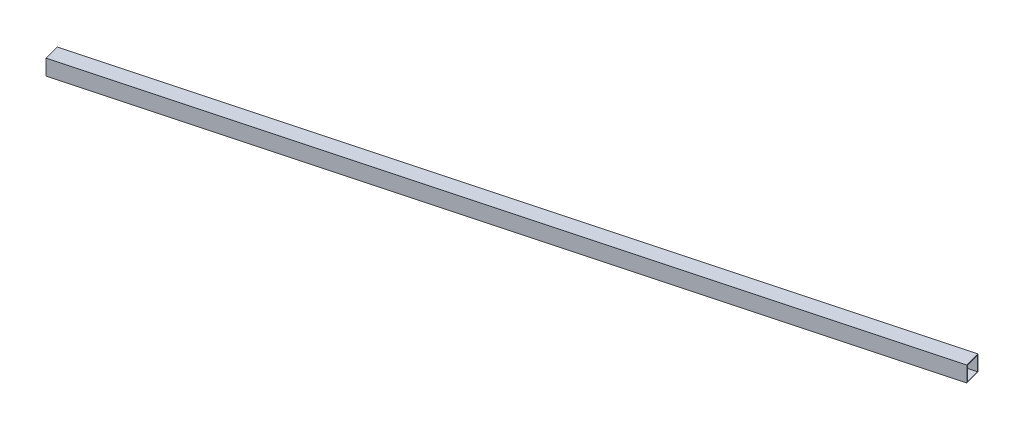
ISO-10303-21;
HEADER;
FILE_DESCRIPTION(('STEP AP214'),'2;1');
FILE_NAME('part.step','',(''),(''),'','','');
FILE_SCHEMA(('AUTOMOTIVE_DESIGN { 1 0 10303 214 1 1 1 1 }'));
ENDSEC;
DATA;
#1=APPLICATION_CONTEXT('core data for automotive mechanical design processes');
#2=APPLICATION_PROTOCOL_DEFINITION('international standard','automotive_design',2000,#1);
#3=PRODUCT_CONTEXT('',#1,'mechanical');
#4=PRODUCT('Part','Part','',(#3));
#5=PRODUCT_RELATED_PRODUCT_CATEGORY('part','',(#4));
#6=PRODUCT_DEFINITION_FORMATION('','',#4);
#7=PRODUCT_DEFINITION_CONTEXT('part definition',#1,'design');
#8=PRODUCT_DEFINITION('design','',#6,#7);
#9=PRODUCT_DEFINITION_SHAPE('','',#8);
#10=(LENGTH_UNIT() NAMED_UNIT(*) SI_UNIT(.MILLI.,.METRE.));
#11=(NAMED_UNIT(*) PLANE_ANGLE_UNIT() SI_UNIT($,.RADIAN.));
#12=(NAMED_UNIT(*) SI_UNIT($,.STERADIAN.) SOLID_ANGLE_UNIT());
#13=UNCERTAINTY_MEASURE_WITH_UNIT(LENGTH_MEASURE(1.E-05),#10,'distance_accuracy_value','');
#14=(GEOMETRIC_REPRESENTATION_CONTEXT(3) GLOBAL_UNCERTAINTY_ASSIGNED_CONTEXT((#13)) GLOBAL_UNIT_ASSIGNED_CONTEXT((#10,
#11,#12)) REPRESENTATION_CONTEXT('',''));
#15=CARTESIAN_POINT('',(0.,0.,0.));
#16=DIRECTION('',(0.,0.,1.));
#17=DIRECTION('',(1.,0.,0.));
#18=AXIS2_PLACEMENT_3D('',#15,#16,#17);
#19=CARTESIAN_POINT('',(2277.106919665,-1721.,2253.538637464));
#20=DIRECTION('',(0.965925826288944,0.,-0.258819045102985));
#21=DIRECTION('',(0.,-1.,0.));
#22=AXIS2_PLACEMENT_3D('',#19,#20,#21);
#23=PLANE('',#22);
#24=DIRECTION('',(-0.258819045102985,0.,-0.965925826288944));
#25=VECTOR('',#24,1.);
#26=CARTESIAN_POINT('',(2289.01259574,-1767.,2297.971225473));
#27=LINE('',#26,#25);
#28=CARTESIAN_POINT('',(2289.01259574,-1767.,2297.971225473));
#29=VERTEX_POINT('',#28);
#30=CARTESIAN_POINT('',(2265.201243591,-1767.,2209.106049454));
#31=VERTEX_POINT('',#30);
#32=EDGE_CURVE('E242',#29,#31,#27,.T.);
#33=ORIENTED_EDGE('',*,*,#32,.F.);
#34=DIRECTION('',(0.,-1.,0.));
#35=VECTOR('',#34,1.);
#36=CARTESIAN_POINT('',(2289.01259574,-1675.,2297.971225473));
#37=LINE('',#36,#35);
#38=CARTESIAN_POINT('',(2289.01259574,-1675.,2297.971225473));
#39=VERTEX_POINT('',#38);
#40=EDGE_CURVE('E120',#39,#29,#37,.T.);
#41=ORIENTED_EDGE('',*,*,#40,.F.);
#42=DIRECTION('',(0.258819045102985,0.,0.965925826288944));
#43=VECTOR('',#42,1.);
#44=CARTESIAN_POINT('',(2265.201243591,-1675.,2209.106049454));
#45=LINE('',#44,#43);
#46=CARTESIAN_POINT('',(2265.201243591,-1675.,2209.106049454));
#47=VERTEX_POINT('',#46);
#48=EDGE_CURVE('E109',#47,#39,#45,.T.);
#49=ORIENTED_EDGE('',*,*,#48,.F.);
#50=DIRECTION('',(0.,1.,0.));
#51=VECTOR('',#50,1.);
#52=CARTESIAN_POINT('',(2265.201243591,-1767.,2209.106049454));
#53=LINE('',#52,#51);
#54=EDGE_CURVE('E26',#31,#47,#53,.T.);
#55=ORIENTED_EDGE('',*,*,#54,.F.);
#56=EDGE_LOOP('',(#33,#41,#49,#55));
#57=FACE_BOUND('',#56,.T.);
#58=DIRECTION('',(0.,1.,0.));
#59=VECTOR('',#58,1.);
#60=CARTESIAN_POINT('',(2264.16596741,-1771.,2205.242346149));
#61=LINE('',#60,#59);
#62=CARTESIAN_POINT('',(2264.16596741,-1771.,2205.242346149));
#63=VERTEX_POINT('',#62);
#64=CARTESIAN_POINT('',(2264.16596741,-1671.,2205.242346149));
#65=VERTEX_POINT('',#64);
#66=EDGE_CURVE('E298',#63,#65,#61,.T.);
#67=ORIENTED_EDGE('',*,*,#66,.T.);
#68=DIRECTION('',(0.258819045102985,0.,0.965925826288944));
#69=VECTOR('',#68,1.);
#70=CARTESIAN_POINT('',(2264.16596741,-1671.,2205.242346149));
#71=LINE('',#70,#69);
#72=CARTESIAN_POINT('',(2290.04787192,-1671.,2301.834928778));
#73=VERTEX_POINT('',#72);
#74=EDGE_CURVE('E286',#65,#73,#71,.T.);
#75=ORIENTED_EDGE('',*,*,#74,.T.);
#76=DIRECTION('',(0.,-1.,0.));
#77=VECTOR('',#76,1.);
#78=CARTESIAN_POINT('',(2290.04787192,-1671.,2301.834928778));
#79=LINE('',#78,#77);
#80=CARTESIAN_POINT('',(2290.04787192,-1771.,2301.834928778));
#81=VERTEX_POINT('',#80);
#82=EDGE_CURVE('E260',#73,#81,#79,.T.);
#83=ORIENTED_EDGE('',*,*,#82,.T.);
#84=DIRECTION('',(-0.258819045102985,0.,-0.965925826288944));
#85=VECTOR('',#84,1.);
#86=CARTESIAN_POINT('',(2290.04787192,-1771.,2301.834928778));
#87=LINE('',#86,#85);
#88=EDGE_CURVE('E251',#81,#63,#87,.T.);
#89=ORIENTED_EDGE('',*,*,#88,.T.);
#90=EDGE_LOOP('',(#67,#75,#83,#89));
#91=FACE_BOUND('',#90,.T.);
#92=ADVANCED_FACE('F17',(#57,#91),#23,.T.);
#93=CARTESIAN_POINT('',(-2343.882233302,-1721.,3491.728949234));
#94=DIRECTION('',(0.965925826288944,0.,-0.258819045102985));
#95=DIRECTION('',(0.,-1.,0.));
#96=AXIS2_PLACEMENT_3D('',#93,#94,#95);
#97=PLANE('',#96);
#98=DIRECTION('',(0.,1.,0.));
#99=VECTOR('',#98,1.);
#100=CARTESIAN_POINT('',(-2355.787909376,-1767.,3447.296361225));
#101=LINE('',#100,#99);
#102=CARTESIAN_POINT('',(-2355.787909376,-1767.,3447.296361225));
#103=VERTEX_POINT('',#102);
#104=CARTESIAN_POINT('',(-2355.787909376,-1675.,3447.296361225));
#105=VERTEX_POINT('',#104);
#106=EDGE_CURVE('E11',#103,#105,#101,.T.);
#107=ORIENTED_EDGE('',*,*,#106,.T.);
#108=DIRECTION('',(0.258819045102985,0.,0.965925826288944));
#109=VECTOR('',#108,1.);
#110=CARTESIAN_POINT('',(-2355.787909376,-1675.,3447.296361225));
#111=LINE('',#110,#109);
#112=CARTESIAN_POINT('',(-2331.976557227,-1675.,3536.161537243));
#113=VERTEX_POINT('',#112);
#114=EDGE_CURVE('E100',#105,#113,#111,.T.);
#115=ORIENTED_EDGE('',*,*,#114,.T.);
#116=DIRECTION('',(0.,-1.,0.));
#117=VECTOR('',#116,1.);
#118=CARTESIAN_POINT('',(-2331.976557227,-1675.,3536.161537243));
#119=LINE('',#118,#117);
#120=CARTESIAN_POINT('',(-2331.976557227,-1767.,3536.161537243));
#121=VERTEX_POINT('',#120);
#122=EDGE_CURVE('E103',#113,#121,#119,.T.);
#123=ORIENTED_EDGE('',*,*,#122,.T.);
#124=DIRECTION('',(-0.258819045102985,0.,-0.965925826288944));
#125=VECTOR('',#124,1.);
#126=CARTESIAN_POINT('',(-2331.976557227,-1767.,3536.161537243));
#127=LINE('',#126,#125);
#128=EDGE_CURVE('E125',#121,#103,#127,.T.);
#129=ORIENTED_EDGE('',*,*,#128,.T.);
#130=EDGE_LOOP('',(#107,#115,#123,#129));
#131=FACE_BOUND('',#130,.T.);
#132=DIRECTION('',(-0.258819045102985,0.,-0.965925826288944));
#133=VECTOR('',#132,1.);
#134=CARTESIAN_POINT('',(-2330.941281047,-1771.,3540.025240548));
#135=LINE('',#134,#133);
#136=CARTESIAN_POINT('',(-2330.941281047,-1771.,3540.025240548));
#137=VERTEX_POINT('',#136);
#138=CARTESIAN_POINT('',(-2356.823185557,-1771.,3443.43265792));
#139=VERTEX_POINT('',#138);
#140=EDGE_CURVE('E254',#137,#139,#135,.T.);
#141=ORIENTED_EDGE('',*,*,#140,.F.);
#142=DIRECTION('',(0.,-1.,0.));
#143=VECTOR('',#142,1.);
#144=CARTESIAN_POINT('',(-2330.941281047,-1671.,3540.025240548));
#145=LINE('',#144,#143);
#146=CARTESIAN_POINT('',(-2330.941281047,-1671.,3540.025240548));
#147=VERTEX_POINT('',#146);
#148=EDGE_CURVE('E272',#147,#137,#145,.T.);
#149=ORIENTED_EDGE('',*,*,#148,.F.);
#150=DIRECTION('',(0.258819045102985,0.,0.965925826288944));
#151=VECTOR('',#150,1.);
#152=CARTESIAN_POINT('',(-2356.823185557,-1671.,3443.43265792));
#153=LINE('',#152,#151);
#154=CARTESIAN_POINT('',(-2356.823185557,-1671.,3443.43265792));
#155=VERTEX_POINT('',#154);
#156=EDGE_CURVE('E278',#155,#147,#153,.T.);
#157=ORIENTED_EDGE('',*,*,#156,.F.);
#158=DIRECTION('',(0.,1.,0.));
#159=VECTOR('',#158,1.);
#160=CARTESIAN_POINT('',(-2356.823185557,-1771.,3443.43265792));
#161=LINE('',#160,#159);
#162=EDGE_CURVE('E296',#139,#155,#161,.T.);
#163=ORIENTED_EDGE('',*,*,#162,.F.);
#164=EDGE_LOOP('',(#141,#149,#157,#163));
#165=FACE_BOUND('',#164,.T.);
#166=ADVANCED_FACE('F19',(#131,#165),#97,.F.);
#167=CARTESIAN_POINT('',(-2355.787909376,-1767.,3447.296361225));
#168=DIRECTION('',(0.258819045102985,0.,0.965925826288944));
#169=DIRECTION('',(0.,-1.,0.));
#170=AXIS2_PLACEMENT_3D('',#167,#168,#169);
#171=PLANE('',#170);
#172=DIRECTION('',(0.965925826288944,0.,-0.258819045102985));
#173=VECTOR('',#172,1.);
#174=CARTESIAN_POINT('',(-2355.787909376,-1767.,3447.296361225));
#175=LINE('',#174,#173);
#176=EDGE_CURVE('E131',#103,#31,#175,.T.);
#177=ORIENTED_EDGE('',*,*,#176,.T.);
#178=ORIENTED_EDGE('',*,*,#54,.T.);
#179=DIRECTION('',(0.965925826288944,0.,-0.258819045102985));
#180=VECTOR('',#179,1.);
#181=CARTESIAN_POINT('',(-2355.787909376,-1675.,3447.296361225));
#182=LINE('',#181,#180);
#183=EDGE_CURVE('E119',#105,#47,#182,.T.);
#184=ORIENTED_EDGE('',*,*,#183,.F.);
#185=ORIENTED_EDGE('',*,*,#106,.F.);
#186=EDGE_LOOP('',(#177,#178,#184,#185));
#187=FACE_BOUND('',#186,.T.);
#188=ADVANCED_FACE('F203',(#187),#171,.T.);
#189=CARTESIAN_POINT('',(-2355.787909376,-1675.,3447.296361225));
#190=DIRECTION('',(0.,-1.,0.));
#191=DIRECTION('',(0.,0.,-1.));
#192=AXIS2_PLACEMENT_3D('',#189,#190,#191);
#193=PLANE('',#192);
#194=ORIENTED_EDGE('',*,*,#183,.T.);
#195=ORIENTED_EDGE('',*,*,#48,.T.);
#196=DIRECTION('',(0.965925826288944,0.,-0.258819045102985));
#197=VECTOR('',#196,1.);
#198=CARTESIAN_POINT('',(-2331.976557227,-1675.,3536.161537243));
#199=LINE('',#198,#197);
#200=EDGE_CURVE('E115',#113,#39,#199,.T.);
#201=ORIENTED_EDGE('',*,*,#200,.F.);
#202=ORIENTED_EDGE('',*,*,#114,.F.);
#203=EDGE_LOOP('',(#194,#195,#201,#202));
#204=FACE_BOUND('',#203,.T.);
#205=ADVANCED_FACE('F122',(#204),#193,.T.);
#206=CARTESIAN_POINT('',(-2331.976557227,-1675.,3536.161537243));
#207=DIRECTION('',(-0.258819045102985,0.,-0.965925826288944));
#208=DIRECTION('',(-0.965925826288944,0.,0.258819045102985));
#209=AXIS2_PLACEMENT_3D('',#206,#207,#208);
#210=PLANE('',#209);
#211=ORIENTED_EDGE('',*,*,#200,.T.);
#212=ORIENTED_EDGE('',*,*,#40,.T.);
#213=DIRECTION('',(0.965925826288944,0.,-0.258819045102985));
#214=VECTOR('',#213,1.);
#215=CARTESIAN_POINT('',(-2331.976557227,-1767.,3536.161537243));
#216=LINE('',#215,#214);
#217=EDGE_CURVE('E117',#121,#29,#216,.T.);
#218=ORIENTED_EDGE('',*,*,#217,.F.);
#219=ORIENTED_EDGE('',*,*,#122,.F.);
#220=EDGE_LOOP('',(#211,#212,#218,#219));
#221=FACE_BOUND('',#220,.T.);
#222=ADVANCED_FACE('F114',(#221),#210,.T.);
#223=CARTESIAN_POINT('',(-2331.976557227,-1767.,3536.161537243));
#224=DIRECTION('',(0.,1.,0.));
#225=DIRECTION('',(1.,0.,0.));
#226=AXIS2_PLACEMENT_3D('',#223,#224,#225);
#227=PLANE('',#226);
#228=ORIENTED_EDGE('',*,*,#217,.T.);
#229=ORIENTED_EDGE('',*,*,#32,.T.);
#230=ORIENTED_EDGE('',*,*,#176,.F.);
#231=ORIENTED_EDGE('',*,*,#128,.F.);
#232=EDGE_LOOP('',(#228,#229,#230,#231));
#233=FACE_BOUND('',#232,.T.);
#234=ADVANCED_FACE('F182',(#233),#227,.T.);
#235=CARTESIAN_POINT('',(-2330.941281047,-1771.,3540.025240548));
#236=DIRECTION('',(0.,1.,0.));
#237=DIRECTION('',(1.,0.,0.));
#238=AXIS2_PLACEMENT_3D('',#235,#236,#237);
#239=PLANE('',#238);
#240=ORIENTED_EDGE('',*,*,#140,.T.);
#241=DIRECTION('',(0.965925826288944,0.,-0.258819045102985));
#242=VECTOR('',#241,1.);
#243=CARTESIAN_POINT('',(-2356.823185557,-1771.,3443.43265792));
#244=LINE('',#243,#242);
#245=EDGE_CURVE('E275',#139,#63,#244,.T.);
#246=ORIENTED_EDGE('',*,*,#245,.T.);
#247=ORIENTED_EDGE('',*,*,#88,.F.);
#248=DIRECTION('',(0.965925826288944,0.,-0.258819045102985));
#249=VECTOR('',#248,1.);
#250=CARTESIAN_POINT('',(-2330.941281047,-1771.,3540.025240548));
#251=LINE('',#250,#249);
#252=EDGE_CURVE('E265',#137,#81,#251,.T.);
#253=ORIENTED_EDGE('',*,*,#252,.F.);
#254=EDGE_LOOP('',(#240,#246,#247,#253));
#255=FACE_BOUND('',#254,.T.);
#256=ADVANCED_FACE('F174',(#255),#239,.F.);
#257=CARTESIAN_POINT('',(-2330.941281047,-1671.,3540.025240548));
#258=DIRECTION('',(-0.258819045102985,0.,-0.965925826288944));
#259=DIRECTION('',(-0.965925826288944,0.,0.258819045102985));
#260=AXIS2_PLACEMENT_3D('',#257,#258,#259);
#261=PLANE('',#260);
#262=ORIENTED_EDGE('',*,*,#148,.T.);
#263=ORIENTED_EDGE('',*,*,#252,.T.);
#264=ORIENTED_EDGE('',*,*,#82,.F.);
#265=DIRECTION('',(0.965925826288944,0.,-0.258819045102985));
#266=VECTOR('',#265,1.);
#267=CARTESIAN_POINT('',(-2330.941281047,-1671.,3540.025240548));
#268=LINE('',#267,#266);
#269=EDGE_CURVE('E281',#147,#73,#268,.T.);
#270=ORIENTED_EDGE('',*,*,#269,.F.);
#271=EDGE_LOOP('',(#262,#263,#264,#270));
#272=FACE_BOUND('',#271,.T.);
#273=ADVANCED_FACE('F166',(#272),#261,.F.);
#274=CARTESIAN_POINT('',(-2356.823185557,-1671.,3443.43265792));
#275=DIRECTION('',(0.,-1.,0.));
#276=DIRECTION('',(0.,0.,-1.));
#277=AXIS2_PLACEMENT_3D('',#274,#275,#276);
#278=PLANE('',#277);
#279=ORIENTED_EDGE('',*,*,#156,.T.);
#280=ORIENTED_EDGE('',*,*,#269,.T.);
#281=ORIENTED_EDGE('',*,*,#74,.F.);
#282=DIRECTION('',(0.965925826288944,0.,-0.258819045102985));
#283=VECTOR('',#282,1.);
#284=CARTESIAN_POINT('',(-2356.823185557,-1671.,3443.43265792));
#285=LINE('',#284,#283);
#286=EDGE_CURVE('E300',#155,#65,#285,.T.);
#287=ORIENTED_EDGE('',*,*,#286,.F.);
#288=EDGE_LOOP('',(#279,#280,#281,#287));
#289=FACE_BOUND('',#288,.T.);
#290=ADVANCED_FACE('F158',(#289),#278,.F.);
#291=CARTESIAN_POINT('',(-2356.823185557,-1771.,3443.43265792));
#292=DIRECTION('',(0.258819045102985,0.,0.965925826288944));
#293=DIRECTION('',(0.,-1.,0.));
#294=AXIS2_PLACEMENT_3D('',#291,#292,#293);
#295=PLANE('',#294);
#296=ORIENTED_EDGE('',*,*,#162,.T.);
#297=ORIENTED_EDGE('',*,*,#286,.T.);
#298=ORIENTED_EDGE('',*,*,#66,.F.);
#299=ORIENTED_EDGE('',*,*,#245,.F.);
#300=EDGE_LOOP('',(#296,#297,#298,#299));
#301=FACE_BOUND('',#300,.T.);
#302=ADVANCED_FACE('F154',(#301),#295,.F.);
#303=CLOSED_SHELL('',(#92,#166,#188,#205,#222,#234,#256,#273,#290,#302));
#304=MANIFOLD_SOLID_BREP('B1',#303);
#305=ADVANCED_BREP_SHAPE_REPRESENTATION('',(#18,#304),#14);
#306=SHAPE_DEFINITION_REPRESENTATION(#9,#305);
ENDSEC;
END-ISO-10303-21;
